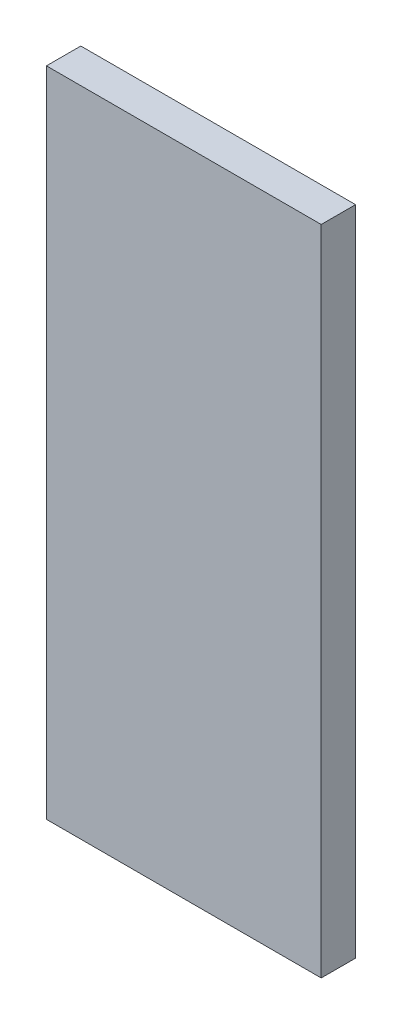
ISO-10303-21;
HEADER;
FILE_DESCRIPTION(('STEP AP214'),'2;1');
FILE_NAME('part.step','',(''),(''),'','','');
FILE_SCHEMA(('AUTOMOTIVE_DESIGN { 1 0 10303 214 1 1 1 1 }'));
ENDSEC;
DATA;
#1=APPLICATION_CONTEXT('core data for automotive mechanical design processes');
#2=APPLICATION_PROTOCOL_DEFINITION('international standard','automotive_design',2000,#1);
#3=PRODUCT_CONTEXT('',#1,'mechanical');
#4=PRODUCT('Part','Part','',(#3));
#5=PRODUCT_RELATED_PRODUCT_CATEGORY('part','',(#4));
#6=PRODUCT_DEFINITION_FORMATION('','',#4);
#7=PRODUCT_DEFINITION_CONTEXT('part definition',#1,'design');
#8=PRODUCT_DEFINITION('design','',#6,#7);
#9=PRODUCT_DEFINITION_SHAPE('','',#8);
#10=(LENGTH_UNIT() NAMED_UNIT(*) SI_UNIT(.MILLI.,.METRE.));
#11=(NAMED_UNIT(*) PLANE_ANGLE_UNIT() SI_UNIT($,.RADIAN.));
#12=(NAMED_UNIT(*) SI_UNIT($,.STERADIAN.) SOLID_ANGLE_UNIT());
#13=UNCERTAINTY_MEASURE_WITH_UNIT(LENGTH_MEASURE(1.E-05),#10,'distance_accuracy_value','');
#14=(GEOMETRIC_REPRESENTATION_CONTEXT(3) GLOBAL_UNCERTAINTY_ASSIGNED_CONTEXT((#13)) GLOBAL_UNIT_ASSIGNED_CONTEXT((#10,
#11,#12)) REPRESENTATION_CONTEXT('',''));
#15=CARTESIAN_POINT('',(0.,0.,0.));
#16=DIRECTION('',(0.,0.,1.));
#17=DIRECTION('',(1.,0.,0.));
#18=AXIS2_PLACEMENT_3D('',#15,#16,#17);
#19=CARTESIAN_POINT('',(0.,0.,3.175));
#20=DIRECTION('',(1.,0.,0.));
#21=DIRECTION('',(0.,1.,0.));
#22=AXIS2_PLACEMENT_3D('',#19,#20,#21);
#23=PLANE('',#22);
#24=DIRECTION('',(0.,-1.,0.));
#25=VECTOR('',#24,1.);
#26=CARTESIAN_POINT('',(0.,0.,0.));
#27=LINE('',#26,#25);
#28=CARTESIAN_POINT('',(0.,0.,0.));
#29=VERTEX_POINT('',#28);
#30=CARTESIAN_POINT('',(0.,-60.325,0.));
#31=VERTEX_POINT('',#30);
#32=EDGE_CURVE('E107',#29,#31,#27,.T.);
#33=ORIENTED_EDGE('',*,*,#32,.T.);
#34=DIRECTION('',(0.,0.,-1.));
#35=VECTOR('',#34,1.);
#36=CARTESIAN_POINT('',(0.,-60.325,3.175));
#37=LINE('',#36,#35);
#38=CARTESIAN_POINT('',(0.,-60.325,3.175));
#39=VERTEX_POINT('',#38);
#40=EDGE_CURVE('E11',#39,#31,#37,.T.);
#41=ORIENTED_EDGE('',*,*,#40,.F.);
#42=DIRECTION('',(0.,-1.,0.));
#43=VECTOR('',#42,1.);
#44=CARTESIAN_POINT('',(0.,0.,3.175));
#45=LINE('',#44,#43);
#46=CARTESIAN_POINT('',(0.,0.,3.175));
#47=VERTEX_POINT('',#46);
#48=EDGE_CURVE('E91',#47,#39,#45,.T.);
#49=ORIENTED_EDGE('',*,*,#48,.F.);
#50=DIRECTION('',(0.,0.,-1.));
#51=VECTOR('',#50,1.);
#52=CARTESIAN_POINT('',(0.,0.,3.175));
#53=LINE('',#52,#51);
#54=EDGE_CURVE('E103',#47,#29,#53,.T.);
#55=ORIENTED_EDGE('',*,*,#54,.T.);
#56=EDGE_LOOP('',(#33,#41,#49,#55));
#57=FACE_BOUND('',#56,.T.);
#58=ADVANCED_FACE('F39',(#57),#23,.F.);
#59=CARTESIAN_POINT('',(0.,-60.325,3.175));
#60=DIRECTION('',(0.,1.,0.));
#61=DIRECTION('',(0.,0.,1.));
#62=AXIS2_PLACEMENT_3D('',#59,#60,#61);
#63=PLANE('',#62);
#64=DIRECTION('',(1.,0.,0.));
#65=VECTOR('',#64,1.);
#66=CARTESIAN_POINT('',(0.,-60.325,0.));
#67=LINE('',#66,#65);
#68=CARTESIAN_POINT('',(25.4,-60.325,0.));
#69=VERTEX_POINT('',#68);
#70=EDGE_CURVE('E96',#31,#69,#67,.T.);
#71=ORIENTED_EDGE('',*,*,#70,.T.);
#72=DIRECTION('',(0.,0.,-1.));
#73=VECTOR('',#72,1.);
#74=CARTESIAN_POINT('',(25.4,-60.325,3.175));
#75=LINE('',#74,#73);
#76=CARTESIAN_POINT('',(25.4,-60.325,3.175));
#77=VERTEX_POINT('',#76);
#78=EDGE_CURVE('E48',#77,#69,#75,.T.);
#79=ORIENTED_EDGE('',*,*,#78,.F.);
#80=DIRECTION('',(1.,0.,0.));
#81=VECTOR('',#80,1.);
#82=CARTESIAN_POINT('',(0.,-60.325,3.175));
#83=LINE('',#82,#81);
#84=EDGE_CURVE('E86',#39,#77,#83,.T.);
#85=ORIENTED_EDGE('',*,*,#84,.F.);
#86=ORIENTED_EDGE('',*,*,#40,.T.);
#87=EDGE_LOOP('',(#71,#79,#85,#86));
#88=FACE_BOUND('',#87,.T.);
#89=ADVANCED_FACE('F95',(#88),#63,.F.);
#90=CARTESIAN_POINT('',(25.4,0.,3.175));
#91=DIRECTION('',(-1.,0.,0.));
#92=DIRECTION('',(0.,-1.,0.));
#93=AXIS2_PLACEMENT_3D('',#90,#91,#92);
#94=PLANE('',#93);
#95=DIRECTION('',(0.,1.,0.));
#96=VECTOR('',#95,1.);
#97=CARTESIAN_POINT('',(25.4,0.,0.));
#98=LINE('',#97,#96);
#99=CARTESIAN_POINT('',(25.4,0.,0.));
#100=VERTEX_POINT('',#99);
#101=EDGE_CURVE('E73',#69,#100,#98,.T.);
#102=ORIENTED_EDGE('',*,*,#101,.T.);
#103=DIRECTION('',(0.,0.,-1.));
#104=VECTOR('',#103,1.);
#105=CARTESIAN_POINT('',(25.4,0.,3.175));
#106=LINE('',#105,#104);
#107=CARTESIAN_POINT('',(25.4,0.,3.175));
#108=VERTEX_POINT('',#107);
#109=EDGE_CURVE('E98',#108,#100,#106,.T.);
#110=ORIENTED_EDGE('',*,*,#109,.F.);
#111=DIRECTION('',(0.,1.,0.));
#112=VECTOR('',#111,1.);
#113=CARTESIAN_POINT('',(25.4,0.,3.175));
#114=LINE('',#113,#112);
#115=EDGE_CURVE('E89',#77,#108,#114,.T.);
#116=ORIENTED_EDGE('',*,*,#115,.F.);
#117=ORIENTED_EDGE('',*,*,#78,.T.);
#118=EDGE_LOOP('',(#102,#110,#116,#117));
#119=FACE_BOUND('',#118,.T.);
#120=ADVANCED_FACE('F99',(#119),#94,.F.);
#121=CARTESIAN_POINT('',(0.,0.,3.175));
#122=DIRECTION('',(0.,-1.,0.));
#123=DIRECTION('',(0.,0.,-1.));
#124=AXIS2_PLACEMENT_3D('',#121,#122,#123);
#125=PLANE('',#124);
#126=DIRECTION('',(-1.,0.,0.));
#127=VECTOR('',#126,1.);
#128=CARTESIAN_POINT('',(0.,0.,0.));
#129=LINE('',#128,#127);
#130=EDGE_CURVE('E79',#100,#29,#129,.T.);
#131=ORIENTED_EDGE('',*,*,#130,.T.);
#132=ORIENTED_EDGE('',*,*,#54,.F.);
#133=DIRECTION('',(-1.,0.,0.));
#134=VECTOR('',#133,1.);
#135=CARTESIAN_POINT('',(0.,0.,3.175));
#136=LINE('',#135,#134);
#137=EDGE_CURVE('E56',#108,#47,#136,.T.);
#138=ORIENTED_EDGE('',*,*,#137,.F.);
#139=ORIENTED_EDGE('',*,*,#109,.T.);
#140=EDGE_LOOP('',(#131,#132,#138,#139));
#141=FACE_BOUND('',#140,.T.);
#142=ADVANCED_FACE('F120',(#141),#125,.F.);
#143=CARTESIAN_POINT('',(0.,0.,3.175));
#144=DIRECTION('',(0.,0.,1.));
#145=DIRECTION('',(1.,0.,0.));
#146=AXIS2_PLACEMENT_3D('',#143,#144,#145);
#147=PLANE('',#146);
#148=ORIENTED_EDGE('',*,*,#48,.T.);
#149=ORIENTED_EDGE('',*,*,#84,.T.);
#150=ORIENTED_EDGE('',*,*,#115,.T.);
#151=ORIENTED_EDGE('',*,*,#137,.T.);
#152=EDGE_LOOP('',(#148,#149,#150,#151));
#153=FACE_BOUND('',#152,.T.);
#154=ADVANCED_FACE('F87',(#153),#147,.T.);
#155=CARTESIAN_POINT('',(0.,0.,0.));
#156=DIRECTION('',(0.,0.,1.));
#157=DIRECTION('',(1.,0.,0.));
#158=AXIS2_PLACEMENT_3D('',#155,#156,#157);
#159=PLANE('',#158);
#160=ORIENTED_EDGE('',*,*,#32,.F.);
#161=ORIENTED_EDGE('',*,*,#130,.F.);
#162=ORIENTED_EDGE('',*,*,#101,.F.);
#163=ORIENTED_EDGE('',*,*,#70,.F.);
#164=EDGE_LOOP('',(#160,#161,#162,#163));
#165=FACE_BOUND('',#164,.T.);
#166=ADVANCED_FACE('F123',(#165),#159,.F.);
#167=CLOSED_SHELL('',(#58,#89,#120,#142,#154,#166));
#168=MANIFOLD_SOLID_BREP('B2',#167);
#169=ADVANCED_BREP_SHAPE_REPRESENTATION('',(#18,#168),#14);
#170=SHAPE_DEFINITION_REPRESENTATION(#9,#169);
ENDSEC;
END-ISO-10303-21;
